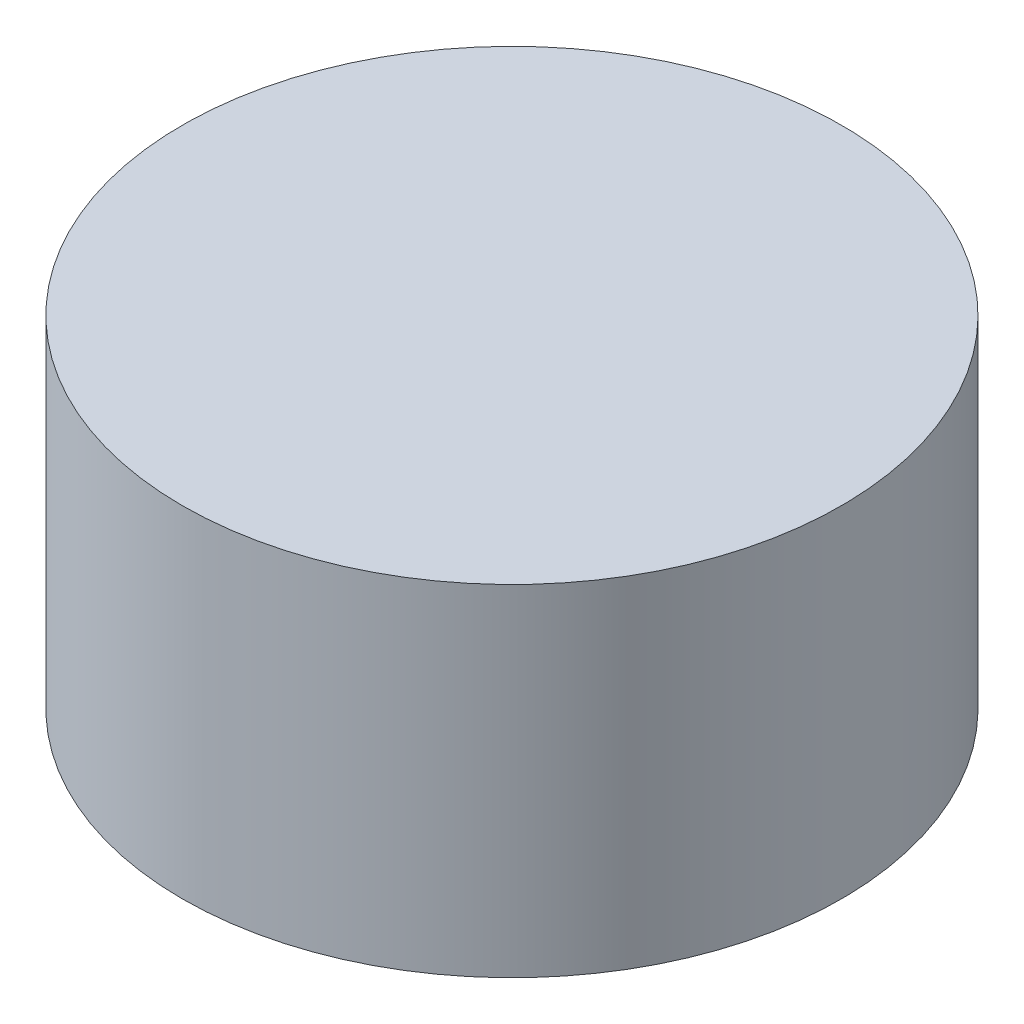
ISO-10303-21;
HEADER;
FILE_DESCRIPTION(('STEP AP214'),'2;1');
FILE_NAME('part.step','',(''),(''),'','','');
FILE_SCHEMA(('AUTOMOTIVE_DESIGN { 1 0 10303 214 1 1 1 1 }'));
ENDSEC;
DATA;
#1=APPLICATION_CONTEXT('core data for automotive mechanical design processes');
#2=APPLICATION_PROTOCOL_DEFINITION('international standard','automotive_design',2000,#1);
#3=PRODUCT_CONTEXT('',#1,'mechanical');
#4=PRODUCT('Part','Part','',(#3));
#5=PRODUCT_RELATED_PRODUCT_CATEGORY('part','',(#4));
#6=PRODUCT_DEFINITION_FORMATION('','',#4);
#7=PRODUCT_DEFINITION_CONTEXT('part definition',#1,'design');
#8=PRODUCT_DEFINITION('design','',#6,#7);
#9=PRODUCT_DEFINITION_SHAPE('','',#8);
#10=(LENGTH_UNIT() NAMED_UNIT(*) SI_UNIT(.MILLI.,.METRE.));
#11=(NAMED_UNIT(*) PLANE_ANGLE_UNIT() SI_UNIT($,.RADIAN.));
#12=(NAMED_UNIT(*) SI_UNIT($,.STERADIAN.) SOLID_ANGLE_UNIT());
#13=UNCERTAINTY_MEASURE_WITH_UNIT(LENGTH_MEASURE(1.E-05),#10,'distance_accuracy_value','');
#14=(GEOMETRIC_REPRESENTATION_CONTEXT(3) GLOBAL_UNCERTAINTY_ASSIGNED_CONTEXT((#13)) GLOBAL_UNIT_ASSIGNED_CONTEXT((#10,
#11,#12)) REPRESENTATION_CONTEXT('',''));
#15=CARTESIAN_POINT('',(0.,0.,0.));
#16=DIRECTION('',(0.,0.,1.));
#17=DIRECTION('',(1.,0.,0.));
#18=AXIS2_PLACEMENT_3D('',#15,#16,#17);
#19=CARTESIAN_POINT('',(0.,31.,0.));
#20=DIRECTION('',(0.,1.,0.));
#21=DIRECTION('',(0.,0.,1.));
#22=AXIS2_PLACEMENT_3D('',#19,#20,#21);
#23=PLANE('',#22);
#24=CARTESIAN_POINT('',(0.,31.,0.));
#25=DIRECTION('',(0.,1.,0.));
#26=DIRECTION('',(0.,0.,1.));
#27=AXIS2_PLACEMENT_3D('',#24,#25,#26);
#28=CIRCLE('',#27,30.);
#29=CARTESIAN_POINT('',(0.,31.,30.));
#30=VERTEX_POINT('',#29);
#31=EDGE_CURVE('E18',#30,#30,#28,.F.);
#32=ORIENTED_EDGE('',*,*,#31,.F.);
#33=EDGE_LOOP('',(#32));
#34=FACE_BOUND('',#33,.T.);
#35=ADVANCED_FACE('F15',(#34),#23,.T.);
#36=CARTESIAN_POINT('',(0.,0.,0.));
#37=DIRECTION('',(0.,1.,0.));
#38=DIRECTION('',(0.,0.,1.));
#39=AXIS2_PLACEMENT_3D('',#36,#37,#38);
#40=PLANE('',#39);
#41=CARTESIAN_POINT('',(0.,0.,0.));
#42=DIRECTION('',(0.,1.,0.));
#43=DIRECTION('',(0.,0.,1.));
#44=AXIS2_PLACEMENT_3D('',#41,#42,#43);
#45=CIRCLE('',#44,30.);
#46=CARTESIAN_POINT('',(0.,0.,30.));
#47=VERTEX_POINT('',#46);
#48=EDGE_CURVE('E10',#47,#47,#45,.T.);
#49=ORIENTED_EDGE('',*,*,#48,.F.);
#50=EDGE_LOOP('',(#49));
#51=FACE_BOUND('',#50,.T.);
#52=ADVANCED_FACE('F30',(#51),#40,.F.);
#53=CARTESIAN_POINT('',(0.,0.,0.));
#54=DIRECTION('',(0.,1.,0.));
#55=DIRECTION('',(0.,0.,1.));
#56=AXIS2_PLACEMENT_3D('',#53,#54,#55);
#57=CYLINDRICAL_SURFACE('',#56,30.);
#58=ORIENTED_EDGE('',*,*,#48,.T.);
#59=EDGE_LOOP('',(#58));
#60=FACE_BOUND('',#59,.T.);
#61=ORIENTED_EDGE('',*,*,#31,.T.);
#62=EDGE_LOOP('',(#61));
#63=FACE_BOUND('',#62,.T.);
#64=ADVANCED_FACE('F27',(#60,#63),#57,.T.);
#65=CLOSED_SHELL('',(#35,#52,#64));
#66=MANIFOLD_SOLID_BREP('B1',#65);
#67=ADVANCED_BREP_SHAPE_REPRESENTATION('',(#18,#66),#14);
#68=SHAPE_DEFINITION_REPRESENTATION(#9,#67);
ENDSEC;
END-ISO-10303-21;
